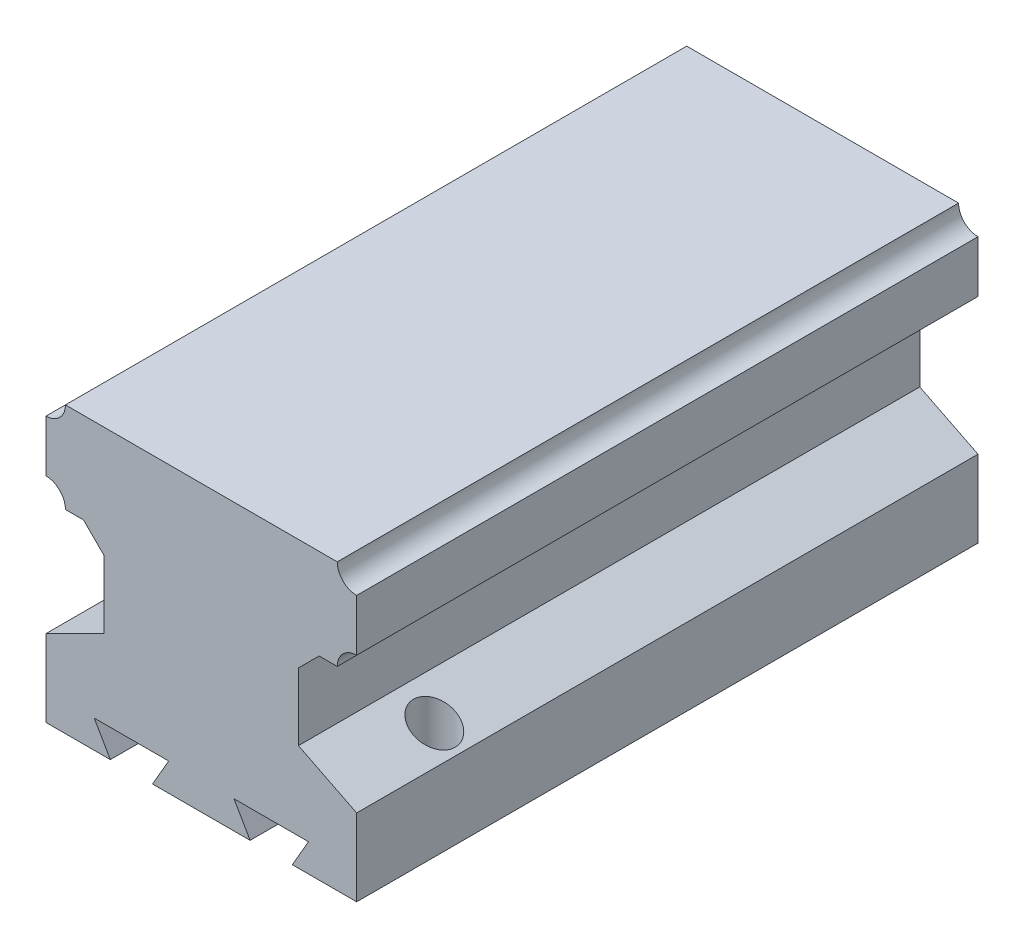
ISO-10303-21;
HEADER;
FILE_DESCRIPTION(('STEP AP214'),'2;1');
FILE_NAME('part.step','',(''),(''),'','','');
FILE_SCHEMA(('AUTOMOTIVE_DESIGN { 1 0 10303 214 1 1 1 1 }'));
ENDSEC;
DATA;
#1=APPLICATION_CONTEXT('core data for automotive mechanical design processes');
#2=APPLICATION_PROTOCOL_DEFINITION('international standard','automotive_design',2000,#1);
#3=PRODUCT_CONTEXT('',#1,'mechanical');
#4=PRODUCT('Part','Part','',(#3));
#5=PRODUCT_RELATED_PRODUCT_CATEGORY('part','',(#4));
#6=PRODUCT_DEFINITION_FORMATION('','',#4);
#7=PRODUCT_DEFINITION_CONTEXT('part definition',#1,'design');
#8=PRODUCT_DEFINITION('design','',#6,#7);
#9=PRODUCT_DEFINITION_SHAPE('','',#8);
#10=(LENGTH_UNIT() NAMED_UNIT(*) SI_UNIT(.MILLI.,.METRE.));
#11=(NAMED_UNIT(*) PLANE_ANGLE_UNIT() SI_UNIT($,.RADIAN.));
#12=(NAMED_UNIT(*) SI_UNIT($,.STERADIAN.) SOLID_ANGLE_UNIT());
#13=UNCERTAINTY_MEASURE_WITH_UNIT(LENGTH_MEASURE(1.E-05),#10,'distance_accuracy_value','');
#14=(GEOMETRIC_REPRESENTATION_CONTEXT(3) GLOBAL_UNCERTAINTY_ASSIGNED_CONTEXT((#13)) GLOBAL_UNIT_ASSIGNED_CONTEXT((#10,
#11,#12)) REPRESENTATION_CONTEXT('',''));
#15=CARTESIAN_POINT('',(0.,0.,0.));
#16=DIRECTION('',(0.,0.,1.));
#17=DIRECTION('',(1.,0.,0.));
#18=AXIS2_PLACEMENT_3D('',#15,#16,#17);
#19=CARTESIAN_POINT('',(-19.05,-15.875,38.1));
#20=DIRECTION('',(0.,1.,0.));
#21=DIRECTION('',(0.,0.,1.));
#22=AXIS2_PLACEMENT_3D('',#19,#20,#21);
#23=PLANE('',#22);
#24=DIRECTION('',(1.,0.,0.));
#25=VECTOR('',#24,1.);
#26=CARTESIAN_POINT('',(-19.05,-15.875,38.1));
#27=LINE('',#26,#25);
#28=CARTESIAN_POINT('',(-5.98479316792876,-15.875,38.1));
#29=VERTEX_POINT('',#28);
#30=CARTESIAN_POINT('',(5.98479316792876,-15.875,38.1));
#31=VERTEX_POINT('',#30);
#32=EDGE_CURVE('E153',#29,#31,#27,.T.);
#33=ORIENTED_EDGE('',*,*,#32,.F.);
#34=DIRECTION('',(0.,0.,-1.));
#35=VECTOR('',#34,1.);
#36=CARTESIAN_POINT('',(-5.98479316792876,-15.875,38.1));
#37=LINE('',#36,#35);
#38=CARTESIAN_POINT('',(-5.98479316792876,-15.875,-38.1));
#39=VERTEX_POINT('',#38);
#40=EDGE_CURVE('E98',#29,#39,#37,.T.);
#41=ORIENTED_EDGE('',*,*,#40,.T.);
#42=DIRECTION('',(1.,0.,0.));
#43=VECTOR('',#42,1.);
#44=CARTESIAN_POINT('',(-19.05,-15.875,-38.1));
#45=LINE('',#44,#43);
#46=CARTESIAN_POINT('',(5.98479316792876,-15.875,-38.1));
#47=VERTEX_POINT('',#46);
#48=EDGE_CURVE('E111',#39,#47,#45,.T.);
#49=ORIENTED_EDGE('',*,*,#48,.T.);
#50=DIRECTION('',(0.,0.,-1.));
#51=VECTOR('',#50,1.);
#52=CARTESIAN_POINT('',(5.98479316792876,-15.875,38.1));
#53=LINE('',#52,#51);
#54=EDGE_CURVE('E309',#31,#47,#53,.T.);
#55=ORIENTED_EDGE('',*,*,#54,.F.);
#56=EDGE_LOOP('',(#33,#41,#49,#55));
#57=FACE_BOUND('',#56,.T.);
#58=ADVANCED_FACE('F36',(#57),#23,.F.);
#59=CARTESIAN_POINT('',(-15.8749999999999,-15.875,25.4));
#60=DIRECTION('',(0.,1.,0.));
#61=DIRECTION('',(0.,0.,1.));
#62=AXIS2_PLACEMENT_3D('',#59,#60,#61);
#63=CIRCLE('',#62,1.89864999999999);
#64=CARTESIAN_POINT('',(-15.8749999999999,-15.875,27.29865));
#65=VERTEX_POINT('',#64);
#66=EDGE_CURVE('E124',#65,#65,#63,.T.);
#67=ORIENTED_EDGE('',*,*,#66,.T.);
#68=EDGE_LOOP('',(#67));
#69=FACE_BOUND('',#68,.T.);
#70=DIRECTION('',(0.,0.,-1.));
#71=VECTOR('',#70,1.);
#72=CARTESIAN_POINT('',(-19.05,-15.875,38.1));
#73=LINE('',#72,#71);
#74=CARTESIAN_POINT('',(-19.05,-15.875,38.1));
#75=VERTEX_POINT('',#74);
#76=CARTESIAN_POINT('',(-19.05,-15.875,-38.1));
#77=VERTEX_POINT('',#76);
#78=EDGE_CURVE('E235',#75,#77,#73,.T.);
#79=ORIENTED_EDGE('',*,*,#78,.T.);
#80=CARTESIAN_POINT('',(-11.1602068320713,-15.875,-38.1));
#81=VERTEX_POINT('',#80);
#82=EDGE_CURVE('E183',#77,#81,#45,.T.);
#83=ORIENTED_EDGE('',*,*,#82,.T.);
#84=DIRECTION('',(0.,0.,-1.));
#85=VECTOR('',#84,1.);
#86=CARTESIAN_POINT('',(-11.1602068320713,-15.875,38.1));
#87=LINE('',#86,#85);
#88=CARTESIAN_POINT('',(-11.1602068320713,-15.875,38.1));
#89=VERTEX_POINT('',#88);
#90=EDGE_CURVE('E328',#89,#81,#87,.T.);
#91=ORIENTED_EDGE('',*,*,#90,.F.);
#92=EDGE_CURVE('E149',#75,#89,#27,.T.);
#93=ORIENTED_EDGE('',*,*,#92,.F.);
#94=EDGE_LOOP('',(#79,#83,#91,#93));
#95=FACE_BOUND('',#94,.T.);
#96=ADVANCED_FACE('F526',(#69,#95),#23,.F.);
#97=CARTESIAN_POINT('',(0.,0.,38.1));
#98=DIRECTION('',(0.,0.,1.));
#99=DIRECTION('',(1.,0.,0.));
#100=AXIS2_PLACEMENT_3D('',#97,#98,#99);
#101=PLANE('',#100);
#102=DIRECTION('',(1.,0.,0.));
#103=VECTOR('',#102,1.);
#104=CARTESIAN_POINT('',(12.7,-12.446,38.1));
#105=LINE('',#104,#103);
#106=CARTESIAN_POINT('',(4.0050590948775,-12.446,38.1));
#107=VERTEX_POINT('',#106);
#108=CARTESIAN_POINT('',(13.1399409051225,-12.446,38.1));
#109=VERTEX_POINT('',#108);
#110=EDGE_CURVE('E316',#107,#109,#105,.T.);
#111=ORIENTED_EDGE('',*,*,#110,.T.);
#112=DIRECTION('',(-0.5,-0.866025403784439,0.));
#113=VECTOR('',#112,1.);
#114=CARTESIAN_POINT('',(12.9199704525613,-12.827,38.1));
#115=LINE('',#114,#113);
#116=CARTESIAN_POINT('',(11.1602068320713,-15.875,38.1));
#117=VERTEX_POINT('',#116);
#118=EDGE_CURVE('E319',#109,#117,#115,.T.);
#119=ORIENTED_EDGE('',*,*,#118,.T.);
#120=CARTESIAN_POINT('',(19.05,-15.875,38.1));
#121=VERTEX_POINT('',#120);
#122=EDGE_CURVE('E147',#117,#121,#27,.T.);
#123=ORIENTED_EDGE('',*,*,#122,.T.);
#124=DIRECTION('',(0.,1.,0.));
#125=VECTOR('',#124,1.);
#126=CARTESIAN_POINT('',(19.05,-15.875,38.1));
#127=LINE('',#126,#125);
#128=CARTESIAN_POINT('',(19.05,-6.42937499999997,38.1));
#129=VERTEX_POINT('',#128);
#130=EDGE_CURVE('E152',#121,#129,#127,.T.);
#131=ORIENTED_EDGE('',*,*,#130,.T.);
#132=DIRECTION('',(0.894427190999914,-0.447213595499962,0.));
#133=VECTOR('',#132,1.);
#134=CARTESIAN_POINT('',(11.90625,-2.85749999999993,38.1));
#135=LINE('',#134,#133);
#136=CARTESIAN_POINT('',(11.90625,-2.85749999999993,38.1));
#137=VERTEX_POINT('',#136);
#138=EDGE_CURVE('E283',#129,#137,#135,.F.);
#139=ORIENTED_EDGE('',*,*,#138,.T.);
#140=DIRECTION('',(0.,1.,0.));
#141=VECTOR('',#140,1.);
#142=CARTESIAN_POINT('',(11.90625,-7.9375,38.1));
#143=LINE('',#142,#141);
#144=CARTESIAN_POINT('',(11.90625,5.39750000000001,38.1));
#145=VERTEX_POINT('',#144);
#146=EDGE_CURVE('E156',#137,#145,#143,.T.);
#147=ORIENTED_EDGE('',*,*,#146,.T.);
#148=DIRECTION('',(-0.707106781186554,-0.707106781186541,0.));
#149=VECTOR('',#148,1.);
#150=CARTESIAN_POINT('',(14.44625,7.9375,38.1));
#151=LINE('',#150,#149);
#152=CARTESIAN_POINT('',(14.44625,7.9375,38.1));
#153=VERTEX_POINT('',#152);
#154=EDGE_CURVE('E12',#145,#153,#151,.F.);
#155=ORIENTED_EDGE('',*,*,#154,.T.);
#156=DIRECTION('',(1.,0.,0.));
#157=VECTOR('',#156,1.);
#158=CARTESIAN_POINT('',(11.90625,7.9375,38.1));
#159=LINE('',#158,#157);
#160=CARTESIAN_POINT('',(16.66875,7.9375,38.1));
#161=VERTEX_POINT('',#160);
#162=EDGE_CURVE('E159',#153,#161,#159,.T.);
#163=ORIENTED_EDGE('',*,*,#162,.T.);
#164=CARTESIAN_POINT('',(19.05,7.9375,38.1));
#165=DIRECTION('',(0.,0.,1.));
#166=DIRECTION('',(1.,0.,0.));
#167=AXIS2_PLACEMENT_3D('',#164,#165,#166);
#168=CIRCLE('',#167,2.38125);
#169=CARTESIAN_POINT('',(19.05,10.31875,38.1));
#170=VERTEX_POINT('',#169);
#171=EDGE_CURVE('E253',#161,#170,#168,.F.);
#172=ORIENTED_EDGE('',*,*,#171,.T.);
#173=DIRECTION('',(0.,1.,0.));
#174=VECTOR('',#173,1.);
#175=CARTESIAN_POINT('',(19.05,10.31875,38.1));
#176=LINE('',#175,#174);
#177=CARTESIAN_POINT('',(19.05,16.66875,38.1));
#178=VERTEX_POINT('',#177);
#179=EDGE_CURVE('E162',#170,#178,#176,.T.);
#180=ORIENTED_EDGE('',*,*,#179,.T.);
#181=CARTESIAN_POINT('',(19.05,19.05,38.1));
#182=DIRECTION('',(0.,0.,1.));
#183=DIRECTION('',(1.,0.,0.));
#184=AXIS2_PLACEMENT_3D('',#181,#182,#183);
#185=CIRCLE('',#184,2.38125);
#186=CARTESIAN_POINT('',(16.66875,19.05,38.1));
#187=VERTEX_POINT('',#186);
#188=EDGE_CURVE('E259',#178,#187,#185,.F.);
#189=ORIENTED_EDGE('',*,*,#188,.T.);
#190=DIRECTION('',(-1.,0.,0.));
#191=VECTOR('',#190,1.);
#192=CARTESIAN_POINT('',(16.66875,19.05,38.1));
#193=LINE('',#192,#191);
#194=CARTESIAN_POINT('',(-16.66875,19.05,38.1));
#195=VERTEX_POINT('',#194);
#196=EDGE_CURVE('E165',#187,#195,#193,.T.);
#197=ORIENTED_EDGE('',*,*,#196,.T.);
#198=CARTESIAN_POINT('',(-19.05,19.05,38.1));
#199=DIRECTION('',(0.,0.,1.));
#200=DIRECTION('',(1.,0.,0.));
#201=AXIS2_PLACEMENT_3D('',#198,#199,#200);
#202=CIRCLE('',#201,2.38125);
#203=CARTESIAN_POINT('',(-19.05,16.66875,38.1));
#204=VERTEX_POINT('',#203);
#205=EDGE_CURVE('E241',#195,#204,#202,.F.);
#206=ORIENTED_EDGE('',*,*,#205,.T.);
#207=DIRECTION('',(0.,-1.,0.));
#208=VECTOR('',#207,1.);
#209=CARTESIAN_POINT('',(-19.05,16.66875,38.1));
#210=LINE('',#209,#208);
#211=CARTESIAN_POINT('',(-19.05,10.31875,38.1));
#212=VERTEX_POINT('',#211);
#213=EDGE_CURVE('E168',#204,#212,#210,.T.);
#214=ORIENTED_EDGE('',*,*,#213,.T.);
#215=CARTESIAN_POINT('',(-19.05,7.93750000000001,38.1));
#216=DIRECTION('',(0.,0.,1.));
#217=DIRECTION('',(1.,0.,0.));
#218=AXIS2_PLACEMENT_3D('',#215,#216,#217);
#219=CIRCLE('',#218,2.38125);
#220=CARTESIAN_POINT('',(-16.66875,7.93750000000001,38.1));
#221=VERTEX_POINT('',#220);
#222=EDGE_CURVE('E247',#212,#221,#219,.F.);
#223=ORIENTED_EDGE('',*,*,#222,.T.);
#224=DIRECTION('',(1.,0.,0.));
#225=VECTOR('',#224,1.);
#226=CARTESIAN_POINT('',(-16.66875,7.93750000000001,38.1));
#227=LINE('',#226,#225);
#228=CARTESIAN_POINT('',(-14.44625,7.93750000000001,38.1));
#229=VERTEX_POINT('',#228);
#230=EDGE_CURVE('E171',#221,#229,#227,.T.);
#231=ORIENTED_EDGE('',*,*,#230,.T.);
#232=DIRECTION('',(-0.707106781186542,0.707106781186553,0.));
#233=VECTOR('',#232,1.);
#234=CARTESIAN_POINT('',(-11.90625,5.39749999999999,38.1));
#235=LINE('',#234,#233);
#236=CARTESIAN_POINT('',(-11.90625,5.39749999999999,38.1));
#237=VERTEX_POINT('',#236);
#238=EDGE_CURVE('E301',#229,#237,#235,.F.);
#239=ORIENTED_EDGE('',*,*,#238,.T.);
#240=DIRECTION('',(0.,-1.,0.));
#241=VECTOR('',#240,1.);
#242=CARTESIAN_POINT('',(-11.90625,7.9375,38.1));
#243=LINE('',#242,#241);
#244=CARTESIAN_POINT('',(-11.90625,-2.85749999999993,38.1));
#245=VERTEX_POINT('',#244);
#246=EDGE_CURVE('E174',#237,#245,#243,.T.);
#247=ORIENTED_EDGE('',*,*,#246,.T.);
#248=DIRECTION('',(0.894427190999914,0.447213595499962,0.));
#249=VECTOR('',#248,1.);
#250=CARTESIAN_POINT('',(-22.06625,-7.9375,38.1));
#251=LINE('',#250,#249);
#252=CARTESIAN_POINT('',(-19.05,-6.42937499999997,38.1));
#253=VERTEX_POINT('',#252);
#254=EDGE_CURVE('E271',#245,#253,#251,.F.);
#255=ORIENTED_EDGE('',*,*,#254,.T.);
#256=DIRECTION('',(0.,-1.,0.));
#257=VECTOR('',#256,1.);
#258=CARTESIAN_POINT('',(-19.05,-7.9375,38.1));
#259=LINE('',#258,#257);
#260=EDGE_CURVE('E144',#253,#75,#259,.T.);
#261=ORIENTED_EDGE('',*,*,#260,.T.);
#262=ORIENTED_EDGE('',*,*,#92,.T.);
#263=DIRECTION('',(-0.500000000000004,0.866025403784436,0.));
#264=VECTOR('',#263,1.);
#265=CARTESIAN_POINT('',(-11.0868833478842,-16.002,38.1));
#266=LINE('',#265,#264);
#267=CARTESIAN_POINT('',(-13.1399409051225,-12.446,38.1));
#268=VERTEX_POINT('',#267);
#269=EDGE_CURVE('E332',#89,#268,#266,.T.);
#270=ORIENTED_EDGE('',*,*,#269,.T.);
#271=DIRECTION('',(1.,0.,0.));
#272=VECTOR('',#271,1.);
#273=CARTESIAN_POINT('',(-4.445,-12.446,38.1));
#274=LINE('',#273,#272);
#275=CARTESIAN_POINT('',(-4.0050590948775,-12.446,38.1));
#276=VERTEX_POINT('',#275);
#277=EDGE_CURVE('E335',#268,#276,#274,.T.);
#278=ORIENTED_EDGE('',*,*,#277,.T.);
#279=DIRECTION('',(-0.500000000000005,-0.866025403784436,0.));
#280=VECTOR('',#279,1.);
#281=CARTESIAN_POINT('',(-6.05811665211584,-16.002,38.1));
#282=LINE('',#281,#280);
#283=EDGE_CURVE('E94',#276,#29,#282,.T.);
#284=ORIENTED_EDGE('',*,*,#283,.T.);
#285=ORIENTED_EDGE('',*,*,#32,.T.);
#286=DIRECTION('',(-0.500000000000003,0.866025403784437,0.));
#287=VECTOR('',#286,1.);
#288=CARTESIAN_POINT('',(4.22502954743875,-12.827,38.1));
#289=LINE('',#288,#287);
#290=EDGE_CURVE('E313',#31,#107,#289,.T.);
#291=ORIENTED_EDGE('',*,*,#290,.T.);
#292=EDGE_LOOP('',(#111,#119,#123,#131,#139,#147,#155,#163,#172,#180,#189,#197,#206,#214,#223,
#231,#239,#247,#255,#261,#262,#270,#278,#284,#285,#291));
#293=FACE_BOUND('',#292,.T.);
#294=ADVANCED_FACE('F339',(#293),#101,.T.);
#295=CARTESIAN_POINT('',(0.,0.,-38.1));
#296=DIRECTION('',(0.,0.,1.));
#297=DIRECTION('',(1.,0.,0.));
#298=AXIS2_PLACEMENT_3D('',#295,#296,#297);
#299=PLANE('',#298);
#300=DIRECTION('',(-0.500000000000004,0.866025403784436,0.));
#301=VECTOR('',#300,1.);
#302=CARTESIAN_POINT('',(-11.0868833478842,-16.002,-38.1));
#303=LINE('',#302,#301);
#304=CARTESIAN_POINT('',(-13.1399409051225,-12.446,-38.1));
#305=VERTEX_POINT('',#304);
#306=EDGE_CURVE('E106',#81,#305,#303,.T.);
#307=ORIENTED_EDGE('',*,*,#306,.F.);
#308=ORIENTED_EDGE('',*,*,#82,.F.);
#309=DIRECTION('',(0.,-1.,0.));
#310=VECTOR('',#309,1.);
#311=CARTESIAN_POINT('',(-19.05,-7.9375,-38.1));
#312=LINE('',#311,#310);
#313=CARTESIAN_POINT('',(-19.05,-6.42937499999997,-38.1));
#314=VERTEX_POINT('',#313);
#315=EDGE_CURVE('E178',#314,#77,#312,.T.);
#316=ORIENTED_EDGE('',*,*,#315,.F.);
#317=DIRECTION('',(-0.894427190999914,-0.447213595499962,0.));
#318=VECTOR('',#317,1.);
#319=CARTESIAN_POINT('',(-1.23825000000006,2.4765000000001,-38.1));
#320=LINE('',#319,#318);
#321=CARTESIAN_POINT('',(-11.90625,-2.85749999999993,-38.1));
#322=VERTEX_POINT('',#321);
#323=EDGE_CURVE('E268',#314,#322,#320,.F.);
#324=ORIENTED_EDGE('',*,*,#323,.T.);
#325=DIRECTION('',(0.,-1.,0.));
#326=VECTOR('',#325,1.);
#327=CARTESIAN_POINT('',(-11.90625,7.9375,-38.1));
#328=LINE('',#327,#326);
#329=CARTESIAN_POINT('',(-11.90625,5.39749999999999,-38.1));
#330=VERTEX_POINT('',#329);
#331=EDGE_CURVE('E148',#330,#322,#328,.T.);
#332=ORIENTED_EDGE('',*,*,#331,.F.);
#333=DIRECTION('',(0.707106781186542,-0.707106781186553,0.));
#334=VECTOR('',#333,1.);
#335=CARTESIAN_POINT('',(-3.2543750000001,-3.25437500000005,-38.1));
#336=LINE('',#335,#334);
#337=CARTESIAN_POINT('',(-14.44625,7.93750000000001,-38.1));
#338=VERTEX_POINT('',#337);
#339=EDGE_CURVE('E298',#330,#338,#336,.F.);
#340=ORIENTED_EDGE('',*,*,#339,.T.);
#341=DIRECTION('',(1.,0.,0.));
#342=VECTOR('',#341,1.);
#343=CARTESIAN_POINT('',(-16.66875,7.93750000000001,-38.1));
#344=LINE('',#343,#342);
#345=CARTESIAN_POINT('',(-16.66875,7.93750000000001,-38.1));
#346=VERTEX_POINT('',#345);
#347=EDGE_CURVE('E204',#346,#338,#344,.T.);
#348=ORIENTED_EDGE('',*,*,#347,.F.);
#349=CARTESIAN_POINT('',(-19.05,7.93750000000001,-38.1));
#350=DIRECTION('',(0.,0.,1.));
#351=DIRECTION('',(1.,0.,0.));
#352=AXIS2_PLACEMENT_3D('',#349,#350,#351);
#353=CIRCLE('',#352,2.38125);
#354=CARTESIAN_POINT('',(-19.05,10.31875,-38.1));
#355=VERTEX_POINT('',#354);
#356=EDGE_CURVE('E244',#346,#355,#353,.T.);
#357=ORIENTED_EDGE('',*,*,#356,.T.);
#358=DIRECTION('',(0.,-1.,0.));
#359=VECTOR('',#358,1.);
#360=CARTESIAN_POINT('',(-19.05,16.66875,-38.1));
#361=LINE('',#360,#359);
#362=CARTESIAN_POINT('',(-19.05,16.66875,-38.1));
#363=VERTEX_POINT('',#362);
#364=EDGE_CURVE('E201',#363,#355,#361,.T.);
#365=ORIENTED_EDGE('',*,*,#364,.F.);
#366=CARTESIAN_POINT('',(-19.05,19.05,-38.1));
#367=DIRECTION('',(0.,0.,1.));
#368=DIRECTION('',(1.,0.,0.));
#369=AXIS2_PLACEMENT_3D('',#366,#367,#368);
#370=CIRCLE('',#369,2.38125);
#371=CARTESIAN_POINT('',(-16.66875,19.05,-38.1));
#372=VERTEX_POINT('',#371);
#373=EDGE_CURVE('E238',#363,#372,#370,.T.);
#374=ORIENTED_EDGE('',*,*,#373,.T.);
#375=DIRECTION('',(-1.,0.,0.));
#376=VECTOR('',#375,1.);
#377=CARTESIAN_POINT('',(16.66875,19.05,-38.1));
#378=LINE('',#377,#376);
#379=CARTESIAN_POINT('',(16.66875,19.05,-38.1));
#380=VERTEX_POINT('',#379);
#381=EDGE_CURVE('E198',#380,#372,#378,.T.);
#382=ORIENTED_EDGE('',*,*,#381,.F.);
#383=CARTESIAN_POINT('',(19.05,19.05,-38.1));
#384=DIRECTION('',(0.,0.,1.));
#385=DIRECTION('',(1.,0.,0.));
#386=AXIS2_PLACEMENT_3D('',#383,#384,#385);
#387=CIRCLE('',#386,2.38125);
#388=CARTESIAN_POINT('',(19.05,16.66875,-38.1));
#389=VERTEX_POINT('',#388);
#390=EDGE_CURVE('E256',#380,#389,#387,.T.);
#391=ORIENTED_EDGE('',*,*,#390,.T.);
#392=DIRECTION('',(0.,1.,0.));
#393=VECTOR('',#392,1.);
#394=CARTESIAN_POINT('',(19.05,10.31875,-38.1));
#395=LINE('',#394,#393);
#396=CARTESIAN_POINT('',(19.05,10.31875,-38.1));
#397=VERTEX_POINT('',#396);
#398=EDGE_CURVE('E195',#397,#389,#395,.T.);
#399=ORIENTED_EDGE('',*,*,#398,.F.);
#400=CARTESIAN_POINT('',(19.05,7.9375,-38.1));
#401=DIRECTION('',(0.,0.,1.));
#402=DIRECTION('',(1.,0.,0.));
#403=AXIS2_PLACEMENT_3D('',#400,#401,#402);
#404=CIRCLE('',#403,2.38125);
#405=CARTESIAN_POINT('',(16.66875,7.9375,-38.1));
#406=VERTEX_POINT('',#405);
#407=EDGE_CURVE('E250',#397,#406,#404,.T.);
#408=ORIENTED_EDGE('',*,*,#407,.T.);
#409=DIRECTION('',(1.,0.,0.));
#410=VECTOR('',#409,1.);
#411=CARTESIAN_POINT('',(11.90625,7.9375,-38.1));
#412=LINE('',#411,#410);
#413=CARTESIAN_POINT('',(14.44625,7.9375,-38.1));
#414=VERTEX_POINT('',#413);
#415=EDGE_CURVE('E192',#414,#406,#412,.T.);
#416=ORIENTED_EDGE('',*,*,#415,.F.);
#417=DIRECTION('',(0.707106781186554,0.707106781186541,0.));
#418=VECTOR('',#417,1.);
#419=CARTESIAN_POINT('',(3.25437499999989,-3.25437499999995,-38.1));
#420=LINE('',#419,#418);
#421=CARTESIAN_POINT('',(11.90625,5.39750000000001,-38.1));
#422=VERTEX_POINT('',#421);
#423=EDGE_CURVE('E46',#414,#422,#420,.F.);
#424=ORIENTED_EDGE('',*,*,#423,.T.);
#425=DIRECTION('',(0.,1.,0.));
#426=VECTOR('',#425,1.);
#427=CARTESIAN_POINT('',(11.90625,-7.9375,-38.1));
#428=LINE('',#427,#426);
#429=CARTESIAN_POINT('',(11.90625,-2.85749999999993,-38.1));
#430=VERTEX_POINT('',#429);
#431=EDGE_CURVE('E189',#430,#422,#428,.T.);
#432=ORIENTED_EDGE('',*,*,#431,.F.);
#433=DIRECTION('',(-0.894427190999914,0.447213595499962,0.));
#434=VECTOR('',#433,1.);
#435=CARTESIAN_POINT('',(1.23825000000006,2.47650000000009,-38.1));
#436=LINE('',#435,#434);
#437=CARTESIAN_POINT('',(19.05,-6.42937499999997,-38.1));
#438=VERTEX_POINT('',#437);
#439=EDGE_CURVE('E277',#430,#438,#436,.F.);
#440=ORIENTED_EDGE('',*,*,#439,.T.);
#441=DIRECTION('',(0.,1.,0.));
#442=VECTOR('',#441,1.);
#443=CARTESIAN_POINT('',(19.05,-15.875,-38.1));
#444=LINE('',#443,#442);
#445=CARTESIAN_POINT('',(19.05,-15.875,-38.1));
#446=VERTEX_POINT('',#445);
#447=EDGE_CURVE('E186',#446,#438,#444,.T.);
#448=ORIENTED_EDGE('',*,*,#447,.F.);
#449=CARTESIAN_POINT('',(11.1602068320713,-15.875,-38.1));
#450=VERTEX_POINT('',#449);
#451=EDGE_CURVE('E181',#450,#446,#45,.T.);
#452=ORIENTED_EDGE('',*,*,#451,.F.);
#453=DIRECTION('',(-0.5,-0.866025403784439,0.));
#454=VECTOR('',#453,1.);
#455=CARTESIAN_POINT('',(12.9199704525613,-12.827,-38.1));
#456=LINE('',#455,#454);
#457=CARTESIAN_POINT('',(13.1399409051225,-12.446,-38.1));
#458=VERTEX_POINT('',#457);
#459=EDGE_CURVE('E143',#458,#450,#456,.T.);
#460=ORIENTED_EDGE('',*,*,#459,.F.);
#461=DIRECTION('',(1.,0.,0.));
#462=VECTOR('',#461,1.);
#463=CARTESIAN_POINT('',(12.7,-12.446,-38.1));
#464=LINE('',#463,#462);
#465=CARTESIAN_POINT('',(4.0050590948775,-12.446,-38.1));
#466=VERTEX_POINT('',#465);
#467=EDGE_CURVE('E113',#466,#458,#464,.T.);
#468=ORIENTED_EDGE('',*,*,#467,.F.);
#469=DIRECTION('',(-0.500000000000003,0.866025403784437,0.));
#470=VECTOR('',#469,1.);
#471=CARTESIAN_POINT('',(4.22502954743875,-12.827,-38.1));
#472=LINE('',#471,#470);
#473=EDGE_CURVE('E54',#47,#466,#472,.T.);
#474=ORIENTED_EDGE('',*,*,#473,.F.);
#475=ORIENTED_EDGE('',*,*,#48,.F.);
#476=DIRECTION('',(-0.500000000000005,-0.866025403784436,0.));
#477=VECTOR('',#476,1.);
#478=CARTESIAN_POINT('',(-6.05811665211584,-16.002,-38.1));
#479=LINE('',#478,#477);
#480=CARTESIAN_POINT('',(-4.0050590948775,-12.446,-38.1));
#481=VERTEX_POINT('',#480);
#482=EDGE_CURVE('E91',#481,#39,#479,.T.);
#483=ORIENTED_EDGE('',*,*,#482,.F.);
#484=DIRECTION('',(1.,0.,0.));
#485=VECTOR('',#484,1.);
#486=CARTESIAN_POINT('',(-4.445,-12.446,-38.1));
#487=LINE('',#486,#485);
#488=EDGE_CURVE('E103',#305,#481,#487,.T.);
#489=ORIENTED_EDGE('',*,*,#488,.F.);
#490=EDGE_LOOP('',(#307,#308,#316,#324,#332,#340,#348,#357,#365,#374,#382,#391,#399,#408,#416,
#424,#432,#440,#448,#452,#460,#468,#474,#475,#483,#489));
#491=FACE_BOUND('',#490,.T.);
#492=ADVANCED_FACE('F109',(#491),#299,.F.);
#493=CARTESIAN_POINT('',(-19.05,-7.9375,38.1));
#494=DIRECTION('',(1.,0.,0.));
#495=DIRECTION('',(0.,1.,0.));
#496=AXIS2_PLACEMENT_3D('',#493,#494,#495);
#497=PLANE('',#496);
#498=ORIENTED_EDGE('',*,*,#315,.T.);
#499=ORIENTED_EDGE('',*,*,#78,.F.);
#500=ORIENTED_EDGE('',*,*,#260,.F.);
#501=DIRECTION('',(0.,0.,1.));
#502=VECTOR('',#501,1.);
#503=CARTESIAN_POINT('',(-19.05,-6.42937499999997,38.1));
#504=LINE('',#503,#502);
#505=EDGE_CURVE('E265',#253,#314,#504,.F.);
#506=ORIENTED_EDGE('',*,*,#505,.T.);
#507=EDGE_LOOP('',(#498,#499,#500,#506));
#508=FACE_BOUND('',#507,.T.);
#509=ADVANCED_FACE('F523',(#508),#497,.F.);
#510=CARTESIAN_POINT('',(15.8750000000001,-15.875,25.4));
#511=DIRECTION('',(0.,1.,0.));
#512=DIRECTION('',(0.,0.,1.));
#513=AXIS2_PLACEMENT_3D('',#510,#511,#512);
#514=CIRCLE('',#513,1.89864999999999);
#515=CARTESIAN_POINT('',(15.8750000000001,-15.875,27.29865));
#516=VERTEX_POINT('',#515);
#517=EDGE_CURVE('E140',#516,#516,#514,.T.);
#518=ORIENTED_EDGE('',*,*,#517,.T.);
#519=EDGE_LOOP('',(#518));
#520=FACE_BOUND('',#519,.T.);
#521=ORIENTED_EDGE('',*,*,#122,.F.);
#522=DIRECTION('',(0.,0.,-1.));
#523=VECTOR('',#522,1.);
#524=CARTESIAN_POINT('',(11.1602068320713,-15.875,38.1));
#525=LINE('',#524,#523);
#526=EDGE_CURVE('E182',#117,#450,#525,.T.);
#527=ORIENTED_EDGE('',*,*,#526,.T.);
#528=ORIENTED_EDGE('',*,*,#451,.T.);
#529=DIRECTION('',(0.,0.,-1.));
#530=VECTOR('',#529,1.);
#531=CARTESIAN_POINT('',(19.05,-15.875,38.1));
#532=LINE('',#531,#530);
#533=EDGE_CURVE('E232',#121,#446,#532,.T.);
#534=ORIENTED_EDGE('',*,*,#533,.F.);
#535=EDGE_LOOP('',(#521,#527,#528,#534));
#536=FACE_BOUND('',#535,.T.);
#537=ADVANCED_FACE('F354',(#520,#536),#23,.F.);
#538=CARTESIAN_POINT('',(19.05,-15.875,38.1));
#539=DIRECTION('',(-1.,0.,0.));
#540=DIRECTION('',(0.,-1.,0.));
#541=AXIS2_PLACEMENT_3D('',#538,#539,#540);
#542=PLANE('',#541);
#543=ORIENTED_EDGE('',*,*,#447,.T.);
#544=DIRECTION('',(0.,0.,-1.));
#545=VECTOR('',#544,1.);
#546=CARTESIAN_POINT('',(19.05,-6.42937499999997,38.1));
#547=LINE('',#546,#545);
#548=EDGE_CURVE('E280',#438,#129,#547,.F.);
#549=ORIENTED_EDGE('',*,*,#548,.T.);
#550=ORIENTED_EDGE('',*,*,#130,.F.);
#551=ORIENTED_EDGE('',*,*,#533,.T.);
#552=EDGE_LOOP('',(#543,#549,#550,#551));
#553=FACE_BOUND('',#552,.T.);
#554=ADVANCED_FACE('F359',(#553),#542,.F.);
#555=CARTESIAN_POINT('',(11.90625,-7.9375,38.1));
#556=DIRECTION('',(-1.,0.,0.));
#557=DIRECTION('',(0.,-1.,0.));
#558=AXIS2_PLACEMENT_3D('',#555,#556,#557);
#559=PLANE('',#558);
#560=ORIENTED_EDGE('',*,*,#431,.T.);
#561=DIRECTION('',(0.,0.,1.));
#562=VECTOR('',#561,1.);
#563=CARTESIAN_POINT('',(11.90625,5.39750000000001,38.1));
#564=LINE('',#563,#562);
#565=EDGE_CURVE('E295',#422,#145,#564,.T.);
#566=ORIENTED_EDGE('',*,*,#565,.T.);
#567=ORIENTED_EDGE('',*,*,#146,.F.);
#568=DIRECTION('',(0.,0.,-1.));
#569=VECTOR('',#568,1.);
#570=CARTESIAN_POINT('',(11.90625,-2.85749999999993,-38.1));
#571=LINE('',#570,#569);
#572=EDGE_CURVE('E274',#137,#430,#571,.T.);
#573=ORIENTED_EDGE('',*,*,#572,.T.);
#574=EDGE_LOOP('',(#560,#566,#567,#573));
#575=FACE_BOUND('',#574,.T.);
#576=ADVANCED_FACE('F376',(#575),#559,.F.);
#577=CARTESIAN_POINT('',(11.90625,7.9375,38.1));
#578=DIRECTION('',(0.,1.,0.));
#579=DIRECTION('',(-1.,0.,0.));
#580=AXIS2_PLACEMENT_3D('',#577,#578,#579);
#581=PLANE('',#580);
#582=ORIENTED_EDGE('',*,*,#162,.F.);
#583=DIRECTION('',(0.,0.,-1.));
#584=VECTOR('',#583,1.);
#585=CARTESIAN_POINT('',(14.44625,7.9375,-38.1));
#586=LINE('',#585,#584);
#587=EDGE_CURVE('E292',#153,#414,#586,.T.);
#588=ORIENTED_EDGE('',*,*,#587,.T.);
#589=ORIENTED_EDGE('',*,*,#415,.T.);
#590=DIRECTION('',(0.,0.,-1.));
#591=VECTOR('',#590,1.);
#592=CARTESIAN_POINT('',(16.66875,7.9375,38.1));
#593=LINE('',#592,#591);
#594=EDGE_CURVE('E229',#161,#406,#593,.T.);
#595=ORIENTED_EDGE('',*,*,#594,.F.);
#596=EDGE_LOOP('',(#582,#588,#589,#595));
#597=FACE_BOUND('',#596,.T.);
#598=ADVANCED_FACE('F455',(#597),#581,.F.);
#599=CARTESIAN_POINT('',(19.05,10.31875,38.1));
#600=DIRECTION('',(-1.,0.,0.));
#601=DIRECTION('',(0.,-1.,0.));
#602=AXIS2_PLACEMENT_3D('',#599,#600,#601);
#603=PLANE('',#602);
#604=ORIENTED_EDGE('',*,*,#398,.T.);
#605=DIRECTION('',(0.,0.,-1.));
#606=VECTOR('',#605,1.);
#607=CARTESIAN_POINT('',(19.05,16.66875,38.1));
#608=LINE('',#607,#606);
#609=EDGE_CURVE('E223',#178,#389,#608,.T.);
#610=ORIENTED_EDGE('',*,*,#609,.F.);
#611=ORIENTED_EDGE('',*,*,#179,.F.);
#612=DIRECTION('',(0.,0.,-1.));
#613=VECTOR('',#612,1.);
#614=CARTESIAN_POINT('',(19.05,10.31875,38.1));
#615=LINE('',#614,#613);
#616=EDGE_CURVE('E226',#170,#397,#615,.T.);
#617=ORIENTED_EDGE('',*,*,#616,.T.);
#618=EDGE_LOOP('',(#604,#610,#611,#617));
#619=FACE_BOUND('',#618,.T.);
#620=ADVANCED_FACE('F467',(#619),#603,.F.);
#621=CARTESIAN_POINT('',(16.66875,19.05,38.1));
#622=DIRECTION('',(0.,-1.,0.));
#623=DIRECTION('',(0.,0.,-1.));
#624=AXIS2_PLACEMENT_3D('',#621,#622,#623);
#625=PLANE('',#624);
#626=ORIENTED_EDGE('',*,*,#381,.T.);
#627=DIRECTION('',(0.,0.,-1.));
#628=VECTOR('',#627,1.);
#629=CARTESIAN_POINT('',(-16.66875,19.05,38.1));
#630=LINE('',#629,#628);
#631=EDGE_CURVE('E217',#195,#372,#630,.T.);
#632=ORIENTED_EDGE('',*,*,#631,.F.);
#633=ORIENTED_EDGE('',*,*,#196,.F.);
#634=DIRECTION('',(0.,0.,-1.));
#635=VECTOR('',#634,1.);
#636=CARTESIAN_POINT('',(16.66875,19.05,38.1));
#637=LINE('',#636,#635);
#638=EDGE_CURVE('E220',#187,#380,#637,.T.);
#639=ORIENTED_EDGE('',*,*,#638,.T.);
#640=EDGE_LOOP('',(#626,#632,#633,#639));
#641=FACE_BOUND('',#640,.T.);
#642=ADVANCED_FACE('F480',(#641),#625,.F.);
#643=CARTESIAN_POINT('',(-19.05,16.66875,38.1));
#644=DIRECTION('',(1.,0.,0.));
#645=DIRECTION('',(0.,1.,0.));
#646=AXIS2_PLACEMENT_3D('',#643,#644,#645);
#647=PLANE('',#646);
#648=ORIENTED_EDGE('',*,*,#364,.T.);
#649=DIRECTION('',(0.,0.,-1.));
#650=VECTOR('',#649,1.);
#651=CARTESIAN_POINT('',(-19.05,10.31875,38.1));
#652=LINE('',#651,#650);
#653=EDGE_CURVE('E211',#212,#355,#652,.T.);
#654=ORIENTED_EDGE('',*,*,#653,.F.);
#655=ORIENTED_EDGE('',*,*,#213,.F.);
#656=DIRECTION('',(0.,0.,-1.));
#657=VECTOR('',#656,1.);
#658=CARTESIAN_POINT('',(-19.05,16.66875,38.1));
#659=LINE('',#658,#657);
#660=EDGE_CURVE('E214',#204,#363,#659,.T.);
#661=ORIENTED_EDGE('',*,*,#660,.T.);
#662=EDGE_LOOP('',(#648,#654,#655,#661));
#663=FACE_BOUND('',#662,.T.);
#664=ADVANCED_FACE('F493',(#663),#647,.F.);
#665=CARTESIAN_POINT('',(-16.66875,7.93750000000001,38.1));
#666=DIRECTION('',(0.,1.,0.));
#667=DIRECTION('',(-1.,0.,0.));
#668=AXIS2_PLACEMENT_3D('',#665,#666,#667);
#669=PLANE('',#668);
#670=ORIENTED_EDGE('',*,*,#347,.T.);
#671=DIRECTION('',(0.,0.,1.));
#672=VECTOR('',#671,1.);
#673=CARTESIAN_POINT('',(-14.44625,7.93750000000001,38.1));
#674=LINE('',#673,#672);
#675=EDGE_CURVE('E289',#338,#229,#674,.T.);
#676=ORIENTED_EDGE('',*,*,#675,.T.);
#677=ORIENTED_EDGE('',*,*,#230,.F.);
#678=DIRECTION('',(0.,0.,-1.));
#679=VECTOR('',#678,1.);
#680=CARTESIAN_POINT('',(-16.66875,7.93750000000001,38.1));
#681=LINE('',#680,#679);
#682=EDGE_CURVE('E177',#221,#346,#681,.T.);
#683=ORIENTED_EDGE('',*,*,#682,.T.);
#684=EDGE_LOOP('',(#670,#676,#677,#683));
#685=FACE_BOUND('',#684,.T.);
#686=ADVANCED_FACE('F503',(#685),#669,.F.);
#687=CARTESIAN_POINT('',(-11.90625,7.9375,38.1));
#688=DIRECTION('',(1.,0.,0.));
#689=DIRECTION('',(0.,1.,0.));
#690=AXIS2_PLACEMENT_3D('',#687,#688,#689);
#691=PLANE('',#690);
#692=ORIENTED_EDGE('',*,*,#246,.F.);
#693=DIRECTION('',(0.,0.,-1.));
#694=VECTOR('',#693,1.);
#695=CARTESIAN_POINT('',(-11.90625,5.39749999999999,-38.1));
#696=LINE('',#695,#694);
#697=EDGE_CURVE('E286',#237,#330,#696,.T.);
#698=ORIENTED_EDGE('',*,*,#697,.T.);
#699=ORIENTED_EDGE('',*,*,#331,.T.);
#700=DIRECTION('',(0.,0.,1.));
#701=VECTOR('',#700,1.);
#702=CARTESIAN_POINT('',(-11.90625,-2.85749999999993,38.1));
#703=LINE('',#702,#701);
#704=EDGE_CURVE('E262',#322,#245,#703,.T.);
#705=ORIENTED_EDGE('',*,*,#704,.T.);
#706=EDGE_LOOP('',(#692,#698,#699,#705));
#707=FACE_BOUND('',#706,.T.);
#708=ADVANCED_FACE('F512',(#707),#691,.F.);
#709=CARTESIAN_POINT('',(-19.05,19.05,38.1));
#710=DIRECTION('',(0.,0.,1.));
#711=DIRECTION('',(1.,0.,0.));
#712=AXIS2_PLACEMENT_3D('',#709,#710,#711);
#713=CYLINDRICAL_SURFACE('',#712,2.38125);
#714=ORIENTED_EDGE('',*,*,#205,.F.);
#715=ORIENTED_EDGE('',*,*,#631,.T.);
#716=ORIENTED_EDGE('',*,*,#373,.F.);
#717=ORIENTED_EDGE('',*,*,#660,.F.);
#718=EDGE_LOOP('',(#714,#715,#716,#717));
#719=FACE_BOUND('',#718,.T.);
#720=ADVANCED_FACE('F487',(#719),#713,.F.);
#721=CARTESIAN_POINT('',(-19.05,7.93750000000001,38.1));
#722=DIRECTION('',(0.,0.,1.));
#723=DIRECTION('',(1.,0.,0.));
#724=AXIS2_PLACEMENT_3D('',#721,#722,#723);
#725=CYLINDRICAL_SURFACE('',#724,2.38125);
#726=ORIENTED_EDGE('',*,*,#222,.F.);
#727=ORIENTED_EDGE('',*,*,#653,.T.);
#728=ORIENTED_EDGE('',*,*,#356,.F.);
#729=ORIENTED_EDGE('',*,*,#682,.F.);
#730=EDGE_LOOP('',(#726,#727,#728,#729));
#731=FACE_BOUND('',#730,.T.);
#732=ADVANCED_FACE('F499',(#731),#725,.F.);
#733=CARTESIAN_POINT('',(19.05,7.9375,38.1));
#734=DIRECTION('',(0.,0.,1.));
#735=DIRECTION('',(1.,0.,0.));
#736=AXIS2_PLACEMENT_3D('',#733,#734,#735);
#737=CYLINDRICAL_SURFACE('',#736,2.38125);
#738=ORIENTED_EDGE('',*,*,#171,.F.);
#739=ORIENTED_EDGE('',*,*,#594,.T.);
#740=ORIENTED_EDGE('',*,*,#407,.F.);
#741=ORIENTED_EDGE('',*,*,#616,.F.);
#742=EDGE_LOOP('',(#738,#739,#740,#741));
#743=FACE_BOUND('',#742,.T.);
#744=ADVANCED_FACE('F461',(#743),#737,.F.);
#745=CARTESIAN_POINT('',(19.05,19.05,38.1));
#746=DIRECTION('',(0.,0.,1.));
#747=DIRECTION('',(1.,0.,0.));
#748=AXIS2_PLACEMENT_3D('',#745,#746,#747);
#749=CYLINDRICAL_SURFACE('',#748,2.38125);
#750=ORIENTED_EDGE('',*,*,#188,.F.);
#751=ORIENTED_EDGE('',*,*,#609,.T.);
#752=ORIENTED_EDGE('',*,*,#390,.F.);
#753=ORIENTED_EDGE('',*,*,#638,.F.);
#754=EDGE_LOOP('',(#750,#751,#752,#753));
#755=FACE_BOUND('',#754,.T.);
#756=ADVANCED_FACE('F474',(#755),#749,.F.);
#757=CARTESIAN_POINT('',(-22.06625,-7.9375,38.1));
#758=DIRECTION('',(-0.447213595499962,0.894427190999914,0.));
#759=DIRECTION('',(0.,0.,1.));
#760=AXIS2_PLACEMENT_3D('',#757,#758,#759);
#761=PLANE('',#760);
#762=CARTESIAN_POINT('',(-15.8749999999999,-4.84187499999991,25.4));
#763=DIRECTION('',(-0.447213595499962,0.894427190999914,0.));
#764=DIRECTION('',(0.894427190999914,0.447213595499962,0.));
#765=AXIS2_PLACEMENT_3D('',#762,#763,#764);
#766=ELLIPSE('',#765,2.85400536308185,2.55269999999999);
#767=CARTESIAN_POINT('',(-13.3222999999999,-3.5655249999999,25.4));
#768=VERTEX_POINT('',#767);
#769=EDGE_CURVE('E125',#768,#768,#766,.F.);
#770=ORIENTED_EDGE('',*,*,#769,.T.);
#771=EDGE_LOOP('',(#770));
#772=FACE_BOUND('',#771,.T.);
#773=ORIENTED_EDGE('',*,*,#254,.F.);
#774=ORIENTED_EDGE('',*,*,#704,.F.);
#775=ORIENTED_EDGE('',*,*,#323,.F.);
#776=ORIENTED_EDGE('',*,*,#505,.F.);
#777=EDGE_LOOP('',(#773,#774,#775,#776));
#778=FACE_BOUND('',#777,.T.);
#779=ADVANCED_FACE('F517',(#772,#778),#761,.T.);
#780=CARTESIAN_POINT('',(11.90625,-2.85749999999993,38.1));
#781=DIRECTION('',(0.447213595499962,0.894427190999914,0.));
#782=DIRECTION('',(0.,0.,1.));
#783=AXIS2_PLACEMENT_3D('',#780,#781,#782);
#784=PLANE('',#783);
#785=CARTESIAN_POINT('',(15.8750000000001,-4.84187499999999,25.4));
#786=DIRECTION('',(0.447213595499962,0.894427190999914,0.));
#787=DIRECTION('',(-0.894427190999914,0.447213595499962,0.));
#788=AXIS2_PLACEMENT_3D('',#785,#786,#787);
#789=ELLIPSE('',#788,2.85400536308185,2.55269999999999);
#790=CARTESIAN_POINT('',(13.3223000000001,-3.56552499999998,25.4));
#791=VERTEX_POINT('',#790);
#792=EDGE_CURVE('E118',#791,#791,#789,.F.);
#793=ORIENTED_EDGE('',*,*,#792,.T.);
#794=EDGE_LOOP('',(#793));
#795=FACE_BOUND('',#794,.T.);
#796=ORIENTED_EDGE('',*,*,#138,.F.);
#797=ORIENTED_EDGE('',*,*,#548,.F.);
#798=ORIENTED_EDGE('',*,*,#439,.F.);
#799=ORIENTED_EDGE('',*,*,#572,.F.);
#800=EDGE_LOOP('',(#796,#797,#798,#799));
#801=FACE_BOUND('',#800,.T.);
#802=ADVANCED_FACE('F368',(#795,#801),#784,.T.);
#803=CARTESIAN_POINT('',(-11.90625,5.39749999999999,38.1));
#804=DIRECTION('',(-0.707106781186553,-0.707106781186542,0.));
#805=DIRECTION('',(0.,0.,1.));
#806=AXIS2_PLACEMENT_3D('',#803,#804,#805);
#807=PLANE('',#806);
#808=ORIENTED_EDGE('',*,*,#238,.F.);
#809=ORIENTED_EDGE('',*,*,#675,.F.);
#810=ORIENTED_EDGE('',*,*,#339,.F.);
#811=ORIENTED_EDGE('',*,*,#697,.F.);
#812=EDGE_LOOP('',(#808,#809,#810,#811));
#813=FACE_BOUND('',#812,.T.);
#814=ADVANCED_FACE('F507',(#813),#807,.T.);
#815=CARTESIAN_POINT('',(14.44625,7.9375,38.1));
#816=DIRECTION('',(0.707106781186541,-0.707106781186554,0.));
#817=DIRECTION('',(0.,0.,1.));
#818=AXIS2_PLACEMENT_3D('',#815,#816,#817);
#819=PLANE('',#818);
#820=ORIENTED_EDGE('',*,*,#154,.F.);
#821=ORIENTED_EDGE('',*,*,#565,.F.);
#822=ORIENTED_EDGE('',*,*,#423,.F.);
#823=ORIENTED_EDGE('',*,*,#587,.F.);
#824=EDGE_LOOP('',(#820,#821,#822,#823));
#825=FACE_BOUND('',#824,.T.);
#826=ADVANCED_FACE('F383',(#825),#819,.T.);
#827=CARTESIAN_POINT('',(-4.445,-12.446,38.1));
#828=DIRECTION('',(0.,1.,0.));
#829=DIRECTION('',(1.,0.,0.));
#830=AXIS2_PLACEMENT_3D('',#827,#828,#829);
#831=PLANE('',#830);
#832=ORIENTED_EDGE('',*,*,#488,.T.);
#833=DIRECTION('',(0.,0.,-1.));
#834=VECTOR('',#833,1.);
#835=CARTESIAN_POINT('',(-4.0050590948775,-12.446,38.1));
#836=LINE('',#835,#834);
#837=EDGE_CURVE('E87',#276,#481,#836,.T.);
#838=ORIENTED_EDGE('',*,*,#837,.F.);
#839=ORIENTED_EDGE('',*,*,#277,.F.);
#840=DIRECTION('',(0.,0.,-1.));
#841=VECTOR('',#840,1.);
#842=CARTESIAN_POINT('',(-13.1399409051225,-12.446,38.1));
#843=LINE('',#842,#841);
#844=EDGE_CURVE('E99',#268,#305,#843,.T.);
#845=ORIENTED_EDGE('',*,*,#844,.T.);
#846=EDGE_LOOP('',(#832,#838,#839,#845));
#847=FACE_BOUND('',#846,.T.);
#848=ADVANCED_FACE('F38',(#847),#831,.F.);
#849=CARTESIAN_POINT('',(-6.05811665211584,-16.002,38.1));
#850=DIRECTION('',(0.866025403784436,-0.500000000000005,0.));
#851=DIRECTION('',(-0.500000000000005,-0.866025403784436,0.));
#852=AXIS2_PLACEMENT_3D('',#849,#850,#851);
#853=PLANE('',#852);
#854=ORIENTED_EDGE('',*,*,#482,.T.);
#855=ORIENTED_EDGE('',*,*,#40,.F.);
#856=ORIENTED_EDGE('',*,*,#283,.F.);
#857=ORIENTED_EDGE('',*,*,#837,.T.);
#858=EDGE_LOOP('',(#854,#855,#856,#857));
#859=FACE_BOUND('',#858,.T.);
#860=ADVANCED_FACE('F89',(#859),#853,.F.);
#861=CARTESIAN_POINT('',(-11.0868833478842,-16.002,38.1));
#862=DIRECTION('',(-0.866025403784437,-0.500000000000004,0.));
#863=DIRECTION('',(-0.500000000000004,0.866025403784437,0.));
#864=AXIS2_PLACEMENT_3D('',#861,#862,#863);
#865=PLANE('',#864);
#866=ORIENTED_EDGE('',*,*,#306,.T.);
#867=ORIENTED_EDGE('',*,*,#844,.F.);
#868=ORIENTED_EDGE('',*,*,#269,.F.);
#869=ORIENTED_EDGE('',*,*,#90,.T.);
#870=EDGE_LOOP('',(#866,#867,#868,#869));
#871=FACE_BOUND('',#870,.T.);
#872=ADVANCED_FACE('F529',(#871),#865,.F.);
#873=CARTESIAN_POINT('',(12.9199704525613,-12.827,38.1));
#874=DIRECTION('',(0.866025403784439,-0.499999999999999,0.));
#875=DIRECTION('',(-0.499999999999999,-0.866025403784439,0.));
#876=AXIS2_PLACEMENT_3D('',#873,#874,#875);
#877=PLANE('',#876);
#878=ORIENTED_EDGE('',*,*,#459,.T.);
#879=ORIENTED_EDGE('',*,*,#526,.F.);
#880=ORIENTED_EDGE('',*,*,#118,.F.);
#881=DIRECTION('',(0.,0.,-1.));
#882=VECTOR('',#881,1.);
#883=CARTESIAN_POINT('',(13.1399409051225,-12.446,38.1));
#884=LINE('',#883,#882);
#885=EDGE_CURVE('E308',#109,#458,#884,.T.);
#886=ORIENTED_EDGE('',*,*,#885,.T.);
#887=EDGE_LOOP('',(#878,#879,#880,#886));
#888=FACE_BOUND('',#887,.T.);
#889=ADVANCED_FACE('F402',(#888),#877,.F.);
#890=CARTESIAN_POINT('',(12.7,-12.446,38.1));
#891=DIRECTION('',(0.,1.,0.));
#892=DIRECTION('',(1.,0.,0.));
#893=AXIS2_PLACEMENT_3D('',#890,#891,#892);
#894=PLANE('',#893);
#895=ORIENTED_EDGE('',*,*,#467,.T.);
#896=ORIENTED_EDGE('',*,*,#885,.F.);
#897=ORIENTED_EDGE('',*,*,#110,.F.);
#898=DIRECTION('',(0.,0.,-1.));
#899=VECTOR('',#898,1.);
#900=CARTESIAN_POINT('',(4.0050590948775,-12.446,38.1));
#901=LINE('',#900,#899);
#902=EDGE_CURVE('E306',#107,#466,#901,.T.);
#903=ORIENTED_EDGE('',*,*,#902,.T.);
#904=EDGE_LOOP('',(#895,#896,#897,#903));
#905=FACE_BOUND('',#904,.T.);
#906=ADVANCED_FACE('F406',(#905),#894,.F.);
#907=CARTESIAN_POINT('',(4.22502954743875,-12.827,38.1));
#908=DIRECTION('',(-0.866025403784437,-0.500000000000003,0.));
#909=DIRECTION('',(-0.500000000000003,0.866025403784437,0.));
#910=AXIS2_PLACEMENT_3D('',#907,#908,#909);
#911=PLANE('',#910);
#912=ORIENTED_EDGE('',*,*,#473,.T.);
#913=ORIENTED_EDGE('',*,*,#902,.F.);
#914=ORIENTED_EDGE('',*,*,#290,.F.);
#915=ORIENTED_EDGE('',*,*,#54,.T.);
#916=EDGE_LOOP('',(#912,#913,#914,#915));
#917=FACE_BOUND('',#916,.T.);
#918=ADVANCED_FACE('F559',(#917),#911,.F.);
#919=CARTESIAN_POINT('',(15.8750000000001,5.3975,25.4));
#920=DIRECTION('',(0.,1.,0.));
#921=DIRECTION('',(0.,0.,1.));
#922=AXIS2_PLACEMENT_3D('',#919,#920,#921);
#923=CYLINDRICAL_SURFACE('',#922,1.89865);
#924=CARTESIAN_POINT('',(15.8750000000001,-13.791492887875,25.4));
#925=DIRECTION('',(0.,1.,0.));
#926=DIRECTION('',(0.,0.,1.));
#927=AXIS2_PLACEMENT_3D('',#924,#925,#926);
#928=CIRCLE('',#927,1.89865);
#929=CARTESIAN_POINT('',(15.8750000000001,-13.791492887875,27.29865));
#930=VERTEX_POINT('',#929);
#931=EDGE_CURVE('E121',#930,#930,#928,.T.);
#932=ORIENTED_EDGE('',*,*,#931,.T.);
#933=EDGE_LOOP('',(#932));
#934=FACE_BOUND('',#933,.T.);
#935=ORIENTED_EDGE('',*,*,#517,.F.);
#936=EDGE_LOOP('',(#935));
#937=FACE_BOUND('',#936,.T.);
#938=ADVANCED_FACE('F556',(#934,#937),#923,.F.);
#939=CARTESIAN_POINT('',(-15.8749999999999,5.39750000000001,25.4));
#940=DIRECTION('',(0.,1.,0.));
#941=DIRECTION('',(0.,0.,1.));
#942=AXIS2_PLACEMENT_3D('',#939,#940,#941);
#943=CYLINDRICAL_SURFACE('',#942,1.89865);
#944=CARTESIAN_POINT('',(-15.8749999999999,-13.791492887875,25.4));
#945=DIRECTION('',(0.,1.,0.));
#946=DIRECTION('',(0.,0.,1.));
#947=AXIS2_PLACEMENT_3D('',#944,#945,#946);
#948=CIRCLE('',#947,1.89865);
#949=CARTESIAN_POINT('',(-15.8749999999999,-13.791492887875,27.29865));
#950=VERTEX_POINT('',#949);
#951=EDGE_CURVE('E40',#950,#950,#948,.T.);
#952=ORIENTED_EDGE('',*,*,#951,.T.);
#953=EDGE_LOOP('',(#952));
#954=FACE_BOUND('',#953,.T.);
#955=ORIENTED_EDGE('',*,*,#66,.F.);
#956=EDGE_LOOP('',(#955));
#957=FACE_BOUND('',#956,.T.);
#958=ADVANCED_FACE('F558',(#954,#957),#943,.F.);
#959=CARTESIAN_POINT('',(15.8750000000001,-13.3985,25.4));
#960=DIRECTION('',(0.,1.,0.));
#961=DIRECTION('',(0.,0.,1.));
#962=AXIS2_PLACEMENT_3D('',#959,#960,#961);
#963=CONICAL_SURFACE('',#962,2.55269999999999,1.02974425867665);
#964=CARTESIAN_POINT('',(15.8750000000001,-13.3985,25.4));
#965=DIRECTION('',(0.,1.,0.));
#966=DIRECTION('',(0.,0.,1.));
#967=AXIS2_PLACEMENT_3D('',#964,#965,#966);
#968=CIRCLE('',#967,2.55269999999999);
#969=CARTESIAN_POINT('',(15.8750000000001,-13.3985,27.9527));
#970=VERTEX_POINT('',#969);
#971=EDGE_CURVE('E122',#970,#970,#968,.T.);
#972=ORIENTED_EDGE('',*,*,#971,.T.);
#973=EDGE_LOOP('',(#972));
#974=FACE_BOUND('',#973,.T.);
#975=ORIENTED_EDGE('',*,*,#931,.F.);
#976=EDGE_LOOP('',(#975));
#977=FACE_BOUND('',#976,.T.);
#978=ADVANCED_FACE('F566',(#974,#977),#963,.F.);
#979=CARTESIAN_POINT('',(15.8750000000001,5.3975,25.4));
#980=DIRECTION('',(0.,1.,0.));
#981=DIRECTION('',(0.,0.,1.));
#982=AXIS2_PLACEMENT_3D('',#979,#980,#981);
#983=CYLINDRICAL_SURFACE('',#982,2.55269999999999);
#984=ORIENTED_EDGE('',*,*,#971,.F.);
#985=EDGE_LOOP('',(#984));
#986=FACE_BOUND('',#985,.T.);
#987=ORIENTED_EDGE('',*,*,#792,.F.);
#988=EDGE_LOOP('',(#987));
#989=FACE_BOUND('',#988,.T.);
#990=ADVANCED_FACE('F751',(#986,#989),#983,.F.);
#991=CARTESIAN_POINT('',(-15.8749999999999,-13.3985,25.4));
#992=DIRECTION('',(0.,1.,0.));
#993=DIRECTION('',(0.,0.,1.));
#994=AXIS2_PLACEMENT_3D('',#991,#992,#993);
#995=CONICAL_SURFACE('',#994,2.5527,1.02974425867665);
#996=CARTESIAN_POINT('',(-15.8749999999999,-13.3985,25.4));
#997=DIRECTION('',(0.,1.,0.));
#998=DIRECTION('',(0.,0.,1.));
#999=AXIS2_PLACEMENT_3D('',#996,#997,#998);
#1000=CIRCLE('',#999,2.5527);
#1001=CARTESIAN_POINT('',(-15.8749999999999,-13.3985,27.9527));
#1002=VERTEX_POINT('',#1001);
#1003=EDGE_CURVE('E127',#1002,#1002,#1000,.T.);
#1004=ORIENTED_EDGE('',*,*,#1003,.T.);
#1005=EDGE_LOOP('',(#1004));
#1006=FACE_BOUND('',#1005,.T.);
#1007=ORIENTED_EDGE('',*,*,#951,.F.);
#1008=EDGE_LOOP('',(#1007));
#1009=FACE_BOUND('',#1008,.T.);
#1010=ADVANCED_FACE('F759',(#1006,#1009),#995,.F.);
#1011=CARTESIAN_POINT('',(-15.8749999999999,5.39750000000001,25.4));
#1012=DIRECTION('',(0.,1.,0.));
#1013=DIRECTION('',(0.,0.,1.));
#1014=AXIS2_PLACEMENT_3D('',#1011,#1012,#1013);
#1015=CYLINDRICAL_SURFACE('',#1014,2.55269999999999);
#1016=ORIENTED_EDGE('',*,*,#1003,.F.);
#1017=EDGE_LOOP('',(#1016));
#1018=FACE_BOUND('',#1017,.T.);
#1019=ORIENTED_EDGE('',*,*,#769,.F.);
#1020=EDGE_LOOP('',(#1019));
#1021=FACE_BOUND('',#1020,.T.);
#1022=ADVANCED_FACE('F768',(#1018,#1021),#1015,.F.);
#1023=CLOSED_SHELL('',(#58,#96,#294,#492,#509,#537,#554,#576,#598,#620,#642,#664,#686,#708,#720,
#732,#744,#756,#779,#802,#814,#826,#848,#860,#872,#889,#906,#918,#938,#958,#978,#990,#1010,#1022));
#1024=MANIFOLD_SOLID_BREP('B2',#1023);
#1025=ADVANCED_BREP_SHAPE_REPRESENTATION('',(#18,#1024),#14);
#1026=SHAPE_DEFINITION_REPRESENTATION(#9,#1025);
ENDSEC;
END-ISO-10303-21;
